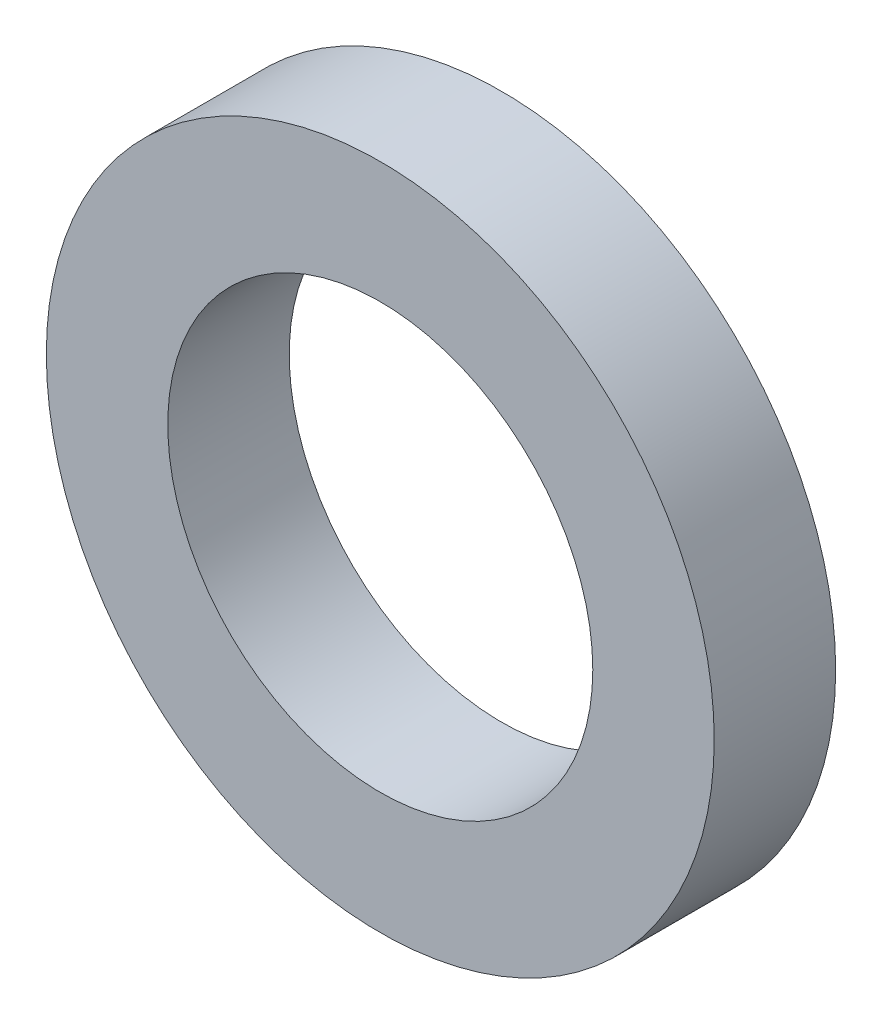
ISO-10303-21;
HEADER;
FILE_DESCRIPTION(('STEP AP214'),'2;1');
FILE_NAME('part.step','',(''),(''),'','','');
FILE_SCHEMA(('AUTOMOTIVE_DESIGN { 1 0 10303 214 1 1 1 1 }'));
ENDSEC;
DATA;
#1=APPLICATION_CONTEXT('core data for automotive mechanical design processes');
#2=APPLICATION_PROTOCOL_DEFINITION('international standard','automotive_design',2000,#1);
#3=PRODUCT_CONTEXT('',#1,'mechanical');
#4=PRODUCT('Part','Part','',(#3));
#5=PRODUCT_RELATED_PRODUCT_CATEGORY('part','',(#4));
#6=PRODUCT_DEFINITION_FORMATION('','',#4);
#7=PRODUCT_DEFINITION_CONTEXT('part definition',#1,'design');
#8=PRODUCT_DEFINITION('design','',#6,#7);
#9=PRODUCT_DEFINITION_SHAPE('','',#8);
#10=(LENGTH_UNIT() NAMED_UNIT(*) SI_UNIT(.MILLI.,.METRE.));
#11=(NAMED_UNIT(*) PLANE_ANGLE_UNIT() SI_UNIT($,.RADIAN.));
#12=(NAMED_UNIT(*) SI_UNIT($,.STERADIAN.) SOLID_ANGLE_UNIT());
#13=UNCERTAINTY_MEASURE_WITH_UNIT(LENGTH_MEASURE(1.E-05),#10,'distance_accuracy_value','');
#14=(GEOMETRIC_REPRESENTATION_CONTEXT(3) GLOBAL_UNCERTAINTY_ASSIGNED_CONTEXT((#13)) GLOBAL_UNIT_ASSIGNED_CONTEXT((#10,
#11,#12)) REPRESENTATION_CONTEXT('',''));
#15=CARTESIAN_POINT('',(0.,0.,0.));
#16=DIRECTION('',(0.,0.,1.));
#17=DIRECTION('',(1.,0.,0.));
#18=AXIS2_PLACEMENT_3D('',#15,#16,#17);
#19=CARTESIAN_POINT('',(0.,0.,10.));
#20=DIRECTION('',(0.,0.,1.));
#21=DIRECTION('',(1.,0.,0.));
#22=AXIS2_PLACEMENT_3D('',#19,#20,#21);
#23=PLANE('',#22);
#24=CARTESIAN_POINT('',(0.,0.,10.));
#25=DIRECTION('',(0.,0.,1.));
#26=DIRECTION('',(1.,0.,0.));
#27=AXIS2_PLACEMENT_3D('',#24,#25,#26);
#28=CIRCLE('',#27,27.5);
#29=CARTESIAN_POINT('',(27.5,0.,10.));
#30=VERTEX_POINT('',#29);
#31=EDGE_CURVE('E10',#30,#30,#28,.T.);
#32=ORIENTED_EDGE('',*,*,#31,.T.);
#33=EDGE_LOOP('',(#32));
#34=FACE_BOUND('',#33,.T.);
#35=CARTESIAN_POINT('',(0.,0.,10.));
#36=DIRECTION('',(0.,0.,1.));
#37=DIRECTION('',(1.,0.,0.));
#38=AXIS2_PLACEMENT_3D('',#35,#36,#37);
#39=CIRCLE('',#38,17.5);
#40=CARTESIAN_POINT('',(17.5,0.,10.));
#41=VERTEX_POINT('',#40);
#42=EDGE_CURVE('E42',#41,#41,#39,.T.);
#43=ORIENTED_EDGE('',*,*,#42,.F.);
#44=EDGE_LOOP('',(#43));
#45=FACE_BOUND('',#44,.T.);
#46=ADVANCED_FACE('F31',(#34,#45),#23,.T.);
#47=CARTESIAN_POINT('',(0.,0.,0.));
#48=DIRECTION('',(0.,0.,1.));
#49=DIRECTION('',(1.,0.,0.));
#50=AXIS2_PLACEMENT_3D('',#47,#48,#49);
#51=PLANE('',#50);
#52=CARTESIAN_POINT('',(0.,0.,0.));
#53=DIRECTION('',(0.,0.,1.));
#54=DIRECTION('',(1.,0.,0.));
#55=AXIS2_PLACEMENT_3D('',#52,#53,#54);
#56=CIRCLE('',#55,27.5);
#57=CARTESIAN_POINT('',(27.5,0.,0.));
#58=VERTEX_POINT('',#57);
#59=EDGE_CURVE('E35',#58,#58,#56,.T.);
#60=ORIENTED_EDGE('',*,*,#59,.F.);
#61=EDGE_LOOP('',(#60));
#62=FACE_BOUND('',#61,.T.);
#63=CARTESIAN_POINT('',(0.,0.,0.));
#64=DIRECTION('',(0.,0.,1.));
#65=DIRECTION('',(1.,0.,0.));
#66=AXIS2_PLACEMENT_3D('',#63,#64,#65);
#67=CIRCLE('',#66,17.5);
#68=CARTESIAN_POINT('',(17.5,0.,0.));
#69=VERTEX_POINT('',#68);
#70=EDGE_CURVE('E44',#69,#69,#67,.T.);
#71=ORIENTED_EDGE('',*,*,#70,.T.);
#72=EDGE_LOOP('',(#71));
#73=FACE_BOUND('',#72,.T.);
#74=ADVANCED_FACE('F54',(#62,#73),#51,.F.);
#75=CARTESIAN_POINT('',(0.,0.,10.));
#76=DIRECTION('',(0.,0.,-1.));
#77=DIRECTION('',(-1.,0.,0.));
#78=AXIS2_PLACEMENT_3D('',#75,#76,#77);
#79=CYLINDRICAL_SURFACE('',#78,27.5);
#80=ORIENTED_EDGE('',*,*,#31,.F.);
#81=EDGE_LOOP('',(#80));
#82=FACE_BOUND('',#81,.T.);
#83=ORIENTED_EDGE('',*,*,#59,.T.);
#84=EDGE_LOOP('',(#83));
#85=FACE_BOUND('',#84,.T.);
#86=ADVANCED_FACE('F33',(#82,#85),#79,.T.);
#87=CARTESIAN_POINT('',(0.,0.,10.));
#88=DIRECTION('',(0.,0.,-1.));
#89=DIRECTION('',(-1.,0.,0.));
#90=AXIS2_PLACEMENT_3D('',#87,#88,#89);
#91=CYLINDRICAL_SURFACE('',#90,17.5);
#92=ORIENTED_EDGE('',*,*,#42,.T.);
#93=EDGE_LOOP('',(#92));
#94=FACE_BOUND('',#93,.T.);
#95=ORIENTED_EDGE('',*,*,#70,.F.);
#96=EDGE_LOOP('',(#95));
#97=FACE_BOUND('',#96,.T.);
#98=ADVANCED_FACE('F50',(#94,#97),#91,.F.);
#99=CLOSED_SHELL('',(#46,#74,#86,#98));
#100=MANIFOLD_SOLID_BREP('B2',#99);
#101=ADVANCED_BREP_SHAPE_REPRESENTATION('',(#18,#100),#14);
#102=SHAPE_DEFINITION_REPRESENTATION(#9,#101);
ENDSEC;
END-ISO-10303-21;
